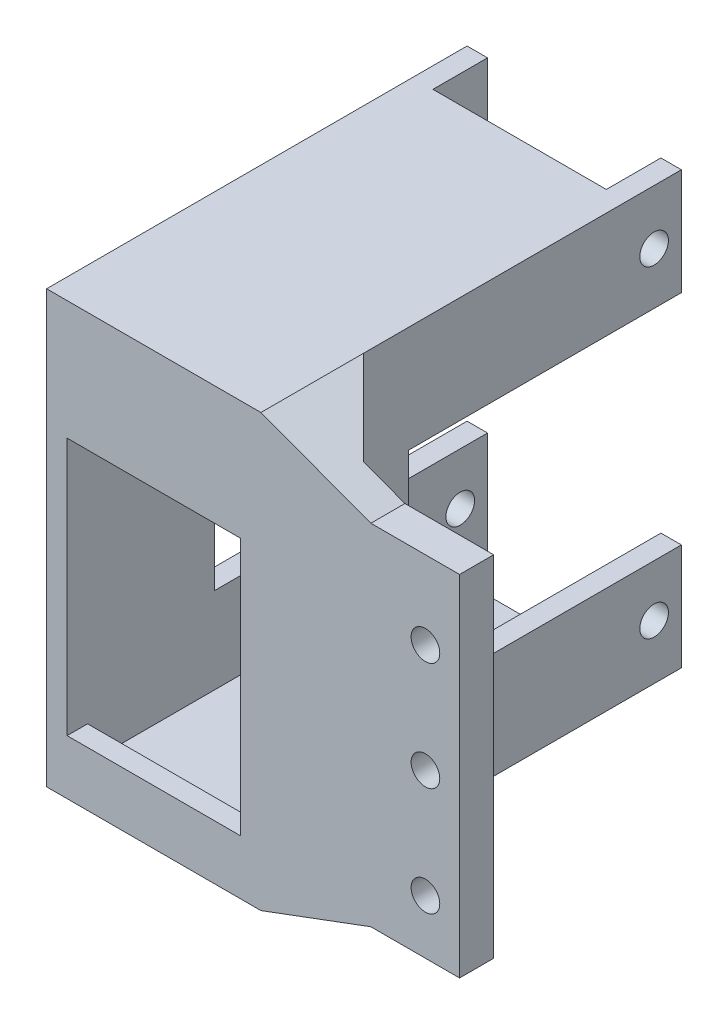
ISO-10303-21;
HEADER;
FILE_DESCRIPTION(('STEP AP214'),'2;1');
FILE_NAME('part.step','',(''),(''),'','','');
FILE_SCHEMA(('AUTOMOTIVE_DESIGN { 1 0 10303 214 1 1 1 1 }'));
ENDSEC;
DATA;
#1=APPLICATION_CONTEXT('core data for automotive mechanical design processes');
#2=APPLICATION_PROTOCOL_DEFINITION('international standard','automotive_design',2000,#1);
#3=PRODUCT_CONTEXT('',#1,'mechanical');
#4=PRODUCT('Part','Part','',(#3));
#5=PRODUCT_RELATED_PRODUCT_CATEGORY('part','',(#4));
#6=PRODUCT_DEFINITION_FORMATION('','',#4);
#7=PRODUCT_DEFINITION_CONTEXT('part definition',#1,'design');
#8=PRODUCT_DEFINITION('design','',#6,#7);
#9=PRODUCT_DEFINITION_SHAPE('','',#8);
#10=(LENGTH_UNIT() NAMED_UNIT(*) SI_UNIT(.MILLI.,.METRE.));
#11=(NAMED_UNIT(*) PLANE_ANGLE_UNIT() SI_UNIT($,.RADIAN.));
#12=(NAMED_UNIT(*) SI_UNIT($,.STERADIAN.) SOLID_ANGLE_UNIT());
#13=UNCERTAINTY_MEASURE_WITH_UNIT(LENGTH_MEASURE(1.E-05),#10,'distance_accuracy_value','');
#14=(GEOMETRIC_REPRESENTATION_CONTEXT(3) GLOBAL_UNCERTAINTY_ASSIGNED_CONTEXT((#13)) GLOBAL_UNIT_ASSIGNED_CONTEXT((#10,
#11,#12)) REPRESENTATION_CONTEXT('',''));
#15=CARTESIAN_POINT('',(0.,0.,0.));
#16=DIRECTION('',(0.,0.,1.));
#17=DIRECTION('',(1.,0.,0.));
#18=AXIS2_PLACEMENT_3D('',#15,#16,#17);
#19=CARTESIAN_POINT('',(0.,0.,-61.6));
#20=DIRECTION('',(0.,0.,1.));
#21=DIRECTION('',(1.,0.,0.));
#22=AXIS2_PLACEMENT_3D('',#19,#20,#21);
#23=PLANE('',#22);
#24=DIRECTION('',(0.,1.,0.));
#25=VECTOR('',#24,1.);
#26=CARTESIAN_POINT('',(-12.7,0.,-61.6));
#27=LINE('',#26,#25);
#28=CARTESIAN_POINT('',(-12.7,-21.9,-61.6));
#29=VERTEX_POINT('',#28);
#30=CARTESIAN_POINT('',(-12.7,-6.3,-61.6));
#31=VERTEX_POINT('',#30);
#32=EDGE_CURVE('E423',#29,#31,#27,.T.);
#33=ORIENTED_EDGE('',*,*,#32,.F.);
#34=DIRECTION('',(1.,0.,0.));
#35=VECTOR('',#34,1.);
#36=CARTESIAN_POINT('',(0.,-21.9,-61.6));
#37=LINE('',#36,#35);
#38=CARTESIAN_POINT('',(-15.7,-21.9,-61.6));
#39=VERTEX_POINT('',#38);
#40=EDGE_CURVE('E428',#39,#29,#37,.T.);
#41=ORIENTED_EDGE('',*,*,#40,.F.);
#42=DIRECTION('',(0.,1.,0.));
#43=VECTOR('',#42,1.);
#44=CARTESIAN_POINT('',(-15.7,0.,-61.6));
#45=LINE('',#44,#43);
#46=CARTESIAN_POINT('',(-15.7,-6.3,-61.6));
#47=VERTEX_POINT('',#46);
#48=EDGE_CURVE('E441',#39,#47,#45,.T.);
#49=ORIENTED_EDGE('',*,*,#48,.T.);
#50=DIRECTION('',(-1.,0.,0.));
#51=VECTOR('',#50,1.);
#52=CARTESIAN_POINT('',(84.3,-6.3,-61.6));
#53=LINE('',#52,#51);
#54=EDGE_CURVE('E363',#31,#47,#53,.T.);
#55=ORIENTED_EDGE('',*,*,#54,.F.);
#56=EDGE_LOOP('',(#33,#41,#49,#55));
#57=FACE_BOUND('',#56,.T.);
#58=ADVANCED_FACE('F47',(#57),#23,.F.);
#59=DIRECTION('',(1.,0.,0.));
#60=VECTOR('',#59,1.);
#61=CARTESIAN_POINT('',(0.,41.3,-61.6));
#62=LINE('',#61,#60);
#63=CARTESIAN_POINT('',(-15.7,41.3,-61.6));
#64=VERTEX_POINT('',#63);
#65=CARTESIAN_POINT('',(-12.7,41.3,-61.6));
#66=VERTEX_POINT('',#65);
#67=EDGE_CURVE('E436',#64,#66,#62,.T.);
#68=ORIENTED_EDGE('',*,*,#67,.T.);
#69=CARTESIAN_POINT('',(-12.7,25.7,-61.6));
#70=VERTEX_POINT('',#69);
#71=EDGE_CURVE('E417',#70,#66,#27,.T.);
#72=ORIENTED_EDGE('',*,*,#71,.F.);
#73=DIRECTION('',(-1.,0.,0.));
#74=VECTOR('',#73,1.);
#75=CARTESIAN_POINT('',(84.3,25.7,-61.6));
#76=LINE('',#75,#74);
#77=CARTESIAN_POINT('',(-15.7,25.7,-61.6));
#78=VERTEX_POINT('',#77);
#79=EDGE_CURVE('E358',#70,#78,#76,.T.);
#80=ORIENTED_EDGE('',*,*,#79,.T.);
#81=EDGE_CURVE('E439',#78,#64,#45,.T.);
#82=ORIENTED_EDGE('',*,*,#81,.T.);
#83=EDGE_LOOP('',(#68,#72,#80,#82));
#84=FACE_BOUND('',#83,.T.);
#85=ADVANCED_FACE('F658',(#84),#23,.F.);
#86=CARTESIAN_POINT('',(0.,-21.9,-3.));
#87=DIRECTION('',(0.,-1.,0.));
#88=DIRECTION('',(0.,0.,-1.));
#89=AXIS2_PLACEMENT_3D('',#86,#87,#88);
#90=PLANE('',#89);
#91=DIRECTION('',(-1.,0.,0.));
#92=VECTOR('',#91,1.);
#93=CARTESIAN_POINT('',(0.,-21.9,-53.6));
#94=LINE('',#93,#92);
#95=CARTESIAN_POINT('',(12.7,-21.9,-53.6));
#96=VERTEX_POINT('',#95);
#97=CARTESIAN_POINT('',(-12.7,-21.9,-53.6));
#98=VERTEX_POINT('',#97);
#99=EDGE_CURVE('E306',#96,#98,#94,.T.);
#100=ORIENTED_EDGE('',*,*,#99,.F.);
#101=DIRECTION('',(0.,0.,-1.));
#102=VECTOR('',#101,1.);
#103=CARTESIAN_POINT('',(12.7,-21.9,-53.6));
#104=LINE('',#103,#102);
#105=CARTESIAN_POINT('',(12.7,-21.9,-61.6));
#106=VERTEX_POINT('',#105);
#107=EDGE_CURVE('E324',#96,#106,#104,.T.);
#108=ORIENTED_EDGE('',*,*,#107,.T.);
#109=CARTESIAN_POINT('',(15.7,-21.9,-61.6));
#110=VERTEX_POINT('',#109);
#111=EDGE_CURVE('E424',#106,#110,#37,.T.);
#112=ORIENTED_EDGE('',*,*,#111,.T.);
#113=DIRECTION('',(0.,0.,1.));
#114=VECTOR('',#113,1.);
#115=CARTESIAN_POINT('',(15.7,-21.9,-61.6));
#116=LINE('',#115,#114);
#117=CARTESIAN_POINT('',(15.7,-21.9,-15.));
#118=VERTEX_POINT('',#117);
#119=EDGE_CURVE('E448',#110,#118,#116,.T.);
#120=ORIENTED_EDGE('',*,*,#119,.T.);
#121=DIRECTION('',(0.,0.,1.));
#122=VECTOR('',#121,1.);
#123=CARTESIAN_POINT('',(15.7,-21.9,-3.));
#124=LINE('',#123,#122);
#125=CARTESIAN_POINT('',(15.7,-21.9,0.));
#126=VERTEX_POINT('',#125);
#127=EDGE_CURVE('E551',#118,#126,#124,.T.);
#128=ORIENTED_EDGE('',*,*,#127,.T.);
#129=DIRECTION('',(1.,0.,0.));
#130=VECTOR('',#129,1.);
#131=CARTESIAN_POINT('',(0.,-21.9,0.));
#132=LINE('',#131,#130);
#133=CARTESIAN_POINT('',(-15.7,-21.9,0.));
#134=VERTEX_POINT('',#133);
#135=EDGE_CURVE('E496',#134,#126,#132,.T.);
#136=ORIENTED_EDGE('',*,*,#135,.F.);
#137=DIRECTION('',(0.,0.,1.));
#138=VECTOR('',#137,1.);
#139=CARTESIAN_POINT('',(-15.7,-21.9,-3.));
#140=LINE('',#139,#138);
#141=EDGE_CURVE('E533',#39,#134,#140,.T.);
#142=ORIENTED_EDGE('',*,*,#141,.F.);
#143=ORIENTED_EDGE('',*,*,#40,.T.);
#144=DIRECTION('',(0.,0.,-1.));
#145=VECTOR('',#144,1.);
#146=CARTESIAN_POINT('',(-12.7,-21.9,-53.6));
#147=LINE('',#146,#145);
#148=EDGE_CURVE('E316',#98,#29,#147,.T.);
#149=ORIENTED_EDGE('',*,*,#148,.F.);
#150=EDGE_LOOP('',(#100,#108,#112,#120,#128,#136,#142,#143,#149));
#151=FACE_BOUND('',#150,.T.);
#152=ADVANCED_FACE('F601',(#151),#90,.T.);
#153=CARTESIAN_POINT('',(0.,38.3,-61.6));
#154=DIRECTION('',(0.,-1.,0.));
#155=DIRECTION('',(0.,0.,-1.));
#156=AXIS2_PLACEMENT_3D('',#153,#154,#155);
#157=PLANE('',#156);
#158=DIRECTION('',(0.,0.,1.));
#159=VECTOR('',#158,1.);
#160=CARTESIAN_POINT('',(-12.7,38.3,-61.6));
#161=LINE('',#160,#159);
#162=CARTESIAN_POINT('',(-12.7,38.3,-53.6));
#163=VERTEX_POINT('',#162);
#164=CARTESIAN_POINT('',(-12.7,38.3,-3.));
#165=VERTEX_POINT('',#164);
#166=EDGE_CURVE('E457',#163,#165,#161,.T.);
#167=ORIENTED_EDGE('',*,*,#166,.F.);
#168=DIRECTION('',(1.,0.,0.));
#169=VECTOR('',#168,1.);
#170=CARTESIAN_POINT('',(0.,38.3,-53.6));
#171=LINE('',#170,#169);
#172=CARTESIAN_POINT('',(12.7,38.3,-53.6));
#173=VERTEX_POINT('',#172);
#174=EDGE_CURVE('E319',#163,#173,#171,.T.);
#175=ORIENTED_EDGE('',*,*,#174,.T.);
#176=DIRECTION('',(0.,0.,1.));
#177=VECTOR('',#176,1.);
#178=CARTESIAN_POINT('',(12.7,38.3,-61.6));
#179=LINE('',#178,#177);
#180=CARTESIAN_POINT('',(12.7,38.3,-3.));
#181=VERTEX_POINT('',#180);
#182=EDGE_CURVE('E451',#173,#181,#179,.T.);
#183=ORIENTED_EDGE('',*,*,#182,.T.);
#184=DIRECTION('',(1.,0.,0.));
#185=VECTOR('',#184,1.);
#186=CARTESIAN_POINT('',(0.,38.3,-3.));
#187=LINE('',#186,#185);
#188=EDGE_CURVE('E466',#165,#181,#187,.T.);
#189=ORIENTED_EDGE('',*,*,#188,.F.);
#190=EDGE_LOOP('',(#167,#175,#183,#189));
#191=FACE_BOUND('',#190,.T.);
#192=ADVANCED_FACE('F710',(#191),#157,.T.);
#193=CARTESIAN_POINT('',(0.,-18.9,-61.6));
#194=DIRECTION('',(0.,-1.,0.));
#195=DIRECTION('',(0.,0.,-1.));
#196=AXIS2_PLACEMENT_3D('',#193,#194,#195);
#197=PLANE('',#196);
#198=DIRECTION('',(1.,0.,0.));
#199=VECTOR('',#198,1.);
#200=CARTESIAN_POINT('',(0.,-18.9,-53.6));
#201=LINE('',#200,#199);
#202=CARTESIAN_POINT('',(-12.7,-18.9,-53.6));
#203=VERTEX_POINT('',#202);
#204=CARTESIAN_POINT('',(12.7,-18.9,-53.6));
#205=VERTEX_POINT('',#204);
#206=EDGE_CURVE('E579',#203,#205,#201,.T.);
#207=ORIENTED_EDGE('',*,*,#206,.F.);
#208=DIRECTION('',(0.,0.,1.));
#209=VECTOR('',#208,1.);
#210=CARTESIAN_POINT('',(-12.7,-18.9,-61.6));
#211=LINE('',#210,#209);
#212=CARTESIAN_POINT('',(-12.7,-18.9,-3.));
#213=VERTEX_POINT('',#212);
#214=EDGE_CURVE('E460',#203,#213,#211,.T.);
#215=ORIENTED_EDGE('',*,*,#214,.T.);
#216=DIRECTION('',(1.,0.,0.));
#217=VECTOR('',#216,1.);
#218=CARTESIAN_POINT('',(0.,-18.9,-3.));
#219=LINE('',#218,#217);
#220=CARTESIAN_POINT('',(12.7,-18.9,-3.00000000000002));
#221=VERTEX_POINT('',#220);
#222=EDGE_CURVE('E446',#213,#221,#219,.T.);
#223=ORIENTED_EDGE('',*,*,#222,.T.);
#224=DIRECTION('',(0.,0.,1.));
#225=VECTOR('',#224,1.);
#226=CARTESIAN_POINT('',(12.7,-18.9,-61.6));
#227=LINE('',#226,#225);
#228=EDGE_CURVE('E444',#205,#221,#227,.T.);
#229=ORIENTED_EDGE('',*,*,#228,.F.);
#230=EDGE_LOOP('',(#207,#215,#223,#229));
#231=FACE_BOUND('',#230,.T.);
#232=ADVANCED_FACE('F667',(#231),#197,.F.);
#233=CARTESIAN_POINT('',(-15.7,0.,-3.));
#234=DIRECTION('',(1.,0.,0.));
#235=DIRECTION('',(0.,0.,-1.));
#236=AXIS2_PLACEMENT_3D('',#233,#234,#235);
#237=PLANE('',#236);
#238=CARTESIAN_POINT('',(-15.7,33.3,-57.6));
#239=DIRECTION('',(-1.,0.,0.));
#240=DIRECTION('',(0.,0.,1.));
#241=AXIS2_PLACEMENT_3D('',#238,#239,#240);
#242=CIRCLE('',#241,2.1);
#243=CARTESIAN_POINT('',(-15.7,33.3,-55.5));
#244=VERTEX_POINT('',#243);
#245=EDGE_CURVE('E339',#244,#244,#242,.T.);
#246=ORIENTED_EDGE('',*,*,#245,.F.);
#247=EDGE_LOOP('',(#246));
#248=FACE_BOUND('',#247,.T.);
#249=CARTESIAN_POINT('',(-15.7,-13.9,-57.6));
#250=DIRECTION('',(-1.,0.,0.));
#251=DIRECTION('',(0.,0.,1.));
#252=AXIS2_PLACEMENT_3D('',#249,#250,#251);
#253=CIRCLE('',#252,2.1);
#254=CARTESIAN_POINT('',(-15.7,-13.9,-55.5));
#255=VERTEX_POINT('',#254);
#256=EDGE_CURVE('E334',#255,#255,#253,.T.);
#257=ORIENTED_EDGE('',*,*,#256,.F.);
#258=EDGE_LOOP('',(#257));
#259=FACE_BOUND('',#258,.T.);
#260=DIRECTION('',(0.,0.,1.));
#261=VECTOR('',#260,1.);
#262=CARTESIAN_POINT('',(-15.7,-6.3,-61.6));
#263=LINE('',#262,#261);
#264=CARTESIAN_POINT('',(-15.7,-6.3,-21.6));
#265=VERTEX_POINT('',#264);
#266=EDGE_CURVE('E344',#47,#265,#263,.T.);
#267=ORIENTED_EDGE('',*,*,#266,.F.);
#268=ORIENTED_EDGE('',*,*,#48,.F.);
#269=ORIENTED_EDGE('',*,*,#141,.T.);
#270=DIRECTION('',(0.,1.,0.));
#271=VECTOR('',#270,1.);
#272=CARTESIAN_POINT('',(-15.7,0.,0.));
#273=LINE('',#272,#271);
#274=CARTESIAN_POINT('',(-15.7,41.3,0.));
#275=VERTEX_POINT('',#274);
#276=EDGE_CURVE('E518',#134,#275,#273,.T.);
#277=ORIENTED_EDGE('',*,*,#276,.T.);
#278=DIRECTION('',(0.,0.,1.));
#279=VECTOR('',#278,1.);
#280=CARTESIAN_POINT('',(-15.7,41.3,-3.));
#281=LINE('',#280,#279);
#282=EDGE_CURVE('E536',#64,#275,#281,.T.);
#283=ORIENTED_EDGE('',*,*,#282,.F.);
#284=ORIENTED_EDGE('',*,*,#81,.F.);
#285=DIRECTION('',(0.,0.,-1.));
#286=VECTOR('',#285,1.);
#287=CARTESIAN_POINT('',(-15.7,25.7,-61.6));
#288=LINE('',#287,#286);
#289=CARTESIAN_POINT('',(-15.7,25.7,-21.6));
#290=VERTEX_POINT('',#289);
#291=EDGE_CURVE('E365',#290,#78,#288,.T.);
#292=ORIENTED_EDGE('',*,*,#291,.F.);
#293=DIRECTION('',(0.,1.,0.));
#294=VECTOR('',#293,1.);
#295=CARTESIAN_POINT('',(-15.7,-6.3,-21.6));
#296=LINE('',#295,#294);
#297=EDGE_CURVE('E362',#265,#290,#296,.T.);
#298=ORIENTED_EDGE('',*,*,#297,.F.);
#299=EDGE_LOOP('',(#267,#268,#269,#277,#283,#284,#292,#298));
#300=FACE_BOUND('',#299,.T.);
#301=ADVANCED_FACE('F653',(#248,#259,#300),#237,.F.);
#302=ORIENTED_EDGE('',*,*,#111,.F.);
#303=DIRECTION('',(0.,1.,0.));
#304=VECTOR('',#303,1.);
#305=CARTESIAN_POINT('',(12.7,0.,-61.6));
#306=LINE('',#305,#304);
#307=CARTESIAN_POINT('',(12.7,-6.3,-61.6));
#308=VERTEX_POINT('',#307);
#309=EDGE_CURVE('E418',#106,#308,#306,.T.);
#310=ORIENTED_EDGE('',*,*,#309,.T.);
#311=CARTESIAN_POINT('',(15.7,-6.3,-61.6));
#312=VERTEX_POINT('',#311);
#313=EDGE_CURVE('E357',#312,#308,#53,.T.);
#314=ORIENTED_EDGE('',*,*,#313,.F.);
#315=DIRECTION('',(0.,1.,0.));
#316=VECTOR('',#315,1.);
#317=CARTESIAN_POINT('',(15.7,0.,-61.6));
#318=LINE('',#317,#316);
#319=EDGE_CURVE('E431',#110,#312,#318,.T.);
#320=ORIENTED_EDGE('',*,*,#319,.F.);
#321=EDGE_LOOP('',(#302,#310,#314,#320));
#322=FACE_BOUND('',#321,.T.);
#323=ADVANCED_FACE('F651',(#322),#23,.F.);
#324=CARTESIAN_POINT('',(0.,0.,-3.));
#325=DIRECTION('',(0.,0.,1.));
#326=DIRECTION('',(1.,0.,0.));
#327=AXIS2_PLACEMENT_3D('',#324,#325,#326);
#328=PLANE('',#327);
#329=DIRECTION('',(0.,1.,0.));
#330=VECTOR('',#329,1.);
#331=CARTESIAN_POINT('',(12.7,0.,-3.));
#332=LINE('',#331,#330);
#333=CARTESIAN_POINT('',(12.7,23.85,-3.));
#334=VERTEX_POINT('',#333);
#335=EDGE_CURVE('E574',#334,#181,#332,.T.);
#336=ORIENTED_EDGE('',*,*,#335,.F.);
#337=DIRECTION('',(1.,0.,0.));
#338=VECTOR('',#337,1.);
#339=CARTESIAN_POINT('',(0.,23.85,-3.));
#340=LINE('',#339,#338);
#341=CARTESIAN_POINT('',(-12.7,23.85,-3.));
#342=VERTEX_POINT('',#341);
#343=EDGE_CURVE('E476',#342,#334,#340,.T.);
#344=ORIENTED_EDGE('',*,*,#343,.F.);
#345=DIRECTION('',(0.,1.,0.));
#346=VECTOR('',#345,1.);
#347=CARTESIAN_POINT('',(-12.7,0.,-3.));
#348=LINE('',#347,#346);
#349=EDGE_CURVE('E571',#342,#165,#348,.T.);
#350=ORIENTED_EDGE('',*,*,#349,.T.);
#351=ORIENTED_EDGE('',*,*,#188,.T.);
#352=EDGE_LOOP('',(#336,#344,#350,#351));
#353=FACE_BOUND('',#352,.T.);
#354=ADVANCED_FACE('F654',(#353),#328,.F.);
#355=CARTESIAN_POINT('',(12.7,-13.9,-3.));
#356=VERTEX_POINT('',#355);
#357=EDGE_CURVE('E569',#221,#356,#332,.T.);
#358=ORIENTED_EDGE('',*,*,#357,.F.);
#359=ORIENTED_EDGE('',*,*,#222,.F.);
#360=CARTESIAN_POINT('',(-12.7,-13.9,-3.));
#361=VERTEX_POINT('',#360);
#362=EDGE_CURVE('E539',#213,#361,#348,.T.);
#363=ORIENTED_EDGE('',*,*,#362,.T.);
#364=DIRECTION('',(1.,0.,0.));
#365=VECTOR('',#364,1.);
#366=CARTESIAN_POINT('',(0.,-13.9,-3.));
#367=LINE('',#366,#365);
#368=EDGE_CURVE('E474',#361,#356,#367,.T.);
#369=ORIENTED_EDGE('',*,*,#368,.T.);
#370=EDGE_LOOP('',(#358,#359,#363,#369));
#371=FACE_BOUND('',#370,.T.);
#372=ADVANCED_FACE('F665',(#371),#328,.F.);
#373=CARTESIAN_POINT('',(0.,41.3,-3.));
#374=DIRECTION('',(0.,-1.,0.));
#375=DIRECTION('',(1.,0.,0.));
#376=AXIS2_PLACEMENT_3D('',#373,#374,#375);
#377=PLANE('',#376);
#378=DIRECTION('',(-1.,0.,0.));
#379=VECTOR('',#378,1.);
#380=CARTESIAN_POINT('',(0.,41.3,-53.6));
#381=LINE('',#380,#379);
#382=CARTESIAN_POINT('',(12.7,41.3,-53.6));
#383=VERTEX_POINT('',#382);
#384=CARTESIAN_POINT('',(-12.7,41.3,-53.6));
#385=VERTEX_POINT('',#384);
#386=EDGE_CURVE('E300',#383,#385,#381,.T.);
#387=ORIENTED_EDGE('',*,*,#386,.T.);
#388=DIRECTION('',(0.,0.,-1.));
#389=VECTOR('',#388,1.);
#390=CARTESIAN_POINT('',(-12.7,41.3,-53.6));
#391=LINE('',#390,#389);
#392=EDGE_CURVE('E313',#385,#66,#391,.T.);
#393=ORIENTED_EDGE('',*,*,#392,.T.);
#394=ORIENTED_EDGE('',*,*,#67,.F.);
#395=ORIENTED_EDGE('',*,*,#282,.T.);
#396=DIRECTION('',(1.,0.,0.));
#397=VECTOR('',#396,1.);
#398=CARTESIAN_POINT('',(0.,41.3,0.));
#399=LINE('',#398,#397);
#400=CARTESIAN_POINT('',(15.7,41.3,0.));
#401=VERTEX_POINT('',#400);
#402=EDGE_CURVE('E520',#275,#401,#399,.T.);
#403=ORIENTED_EDGE('',*,*,#402,.T.);
#404=DIRECTION('',(0.,0.,1.));
#405=VECTOR('',#404,1.);
#406=CARTESIAN_POINT('',(15.7,41.3,-3.));
#407=LINE('',#406,#405);
#408=CARTESIAN_POINT('',(15.7,41.3,-15.));
#409=VERTEX_POINT('',#408);
#410=EDGE_CURVE('E66',#409,#401,#407,.T.);
#411=ORIENTED_EDGE('',*,*,#410,.F.);
#412=DIRECTION('',(0.,0.,1.));
#413=VECTOR('',#412,1.);
#414=CARTESIAN_POINT('',(15.7,41.3,-61.6));
#415=LINE('',#414,#413);
#416=CARTESIAN_POINT('',(15.7,41.3,-61.6));
#417=VERTEX_POINT('',#416);
#418=EDGE_CURVE('E447',#417,#409,#415,.T.);
#419=ORIENTED_EDGE('',*,*,#418,.F.);
#420=CARTESIAN_POINT('',(12.7,41.3,-61.6));
#421=VERTEX_POINT('',#420);
#422=EDGE_CURVE('E434',#421,#417,#62,.T.);
#423=ORIENTED_EDGE('',*,*,#422,.F.);
#424=DIRECTION('',(0.,0.,-1.));
#425=VECTOR('',#424,1.);
#426=CARTESIAN_POINT('',(12.7,41.3,-53.6));
#427=LINE('',#426,#425);
#428=EDGE_CURVE('E312',#383,#421,#427,.T.);
#429=ORIENTED_EDGE('',*,*,#428,.F.);
#430=EDGE_LOOP('',(#387,#393,#394,#395,#403,#411,#419,#423,#429));
#431=FACE_BOUND('',#430,.T.);
#432=ADVANCED_FACE('F635',(#431),#377,.F.);
#433=CARTESIAN_POINT('',(15.4289488838454,41.4010128383185,-3.));
#434=DIRECTION('',(-0.349209233144346,-0.937044775603993,0.));
#435=DIRECTION('',(0.937044775603993,-0.349209233144346,0.));
#436=AXIS2_PLACEMENT_3D('',#433,#434,#435);
#437=PLANE('',#436);
#438=DIRECTION('',(0.937044775603993,-0.349209233144346,0.));
#439=VECTOR('',#438,1.);
#440=CARTESIAN_POINT('',(15.4289488838454,41.4010128383185,0.));
#441=LINE('',#440,#439);
#442=CARTESIAN_POINT('',(31.8,35.3,0.));
#443=VERTEX_POINT('',#442);
#444=EDGE_CURVE('E268',#401,#443,#441,.T.);
#445=ORIENTED_EDGE('',*,*,#444,.T.);
#446=DIRECTION('',(0.,0.,1.));
#447=VECTOR('',#446,1.);
#448=CARTESIAN_POINT('',(31.8,35.3,-3.));
#449=LINE('',#448,#447);
#450=CARTESIAN_POINT('',(31.8,35.3,-5.));
#451=VERTEX_POINT('',#450);
#452=EDGE_CURVE('E263',#451,#443,#449,.T.);
#453=ORIENTED_EDGE('',*,*,#452,.F.);
#454=DIRECTION('',(0.937044775603993,-0.349209233144346,0.));
#455=VECTOR('',#454,1.);
#456=CARTESIAN_POINT('',(15.4289488838454,41.4010128383185,-5.));
#457=LINE('',#456,#455);
#458=CARTESIAN_POINT('',(25.7000000000001,37.5732919254658,-5.));
#459=VERTEX_POINT('',#458);
#460=EDGE_CURVE('E246',#459,#451,#457,.T.);
#461=ORIENTED_EDGE('',*,*,#460,.F.);
#462=DIRECTION('',(-0.683764315212211,0.254818999457967,-0.683764315212205));
#463=VECTOR('',#462,1.);
#464=CARTESIAN_POINT('',(21.1660780635619,39.262952274449,-9.53392193643811));
#465=LINE('',#464,#463);
#466=EDGE_CURVE('E58',#459,#409,#465,.T.);
#467=ORIENTED_EDGE('',*,*,#466,.T.);
#468=ORIENTED_EDGE('',*,*,#410,.T.);
#469=EDGE_LOOP('',(#445,#453,#461,#467,#468));
#470=FACE_BOUND('',#469,.T.);
#471=ADVANCED_FACE('F265',(#470),#437,.F.);
#472=CARTESIAN_POINT('',(0.,35.3,-3.));
#473=DIRECTION('',(0.,-1.,0.));
#474=DIRECTION('',(0.,0.,-1.));
#475=AXIS2_PLACEMENT_3D('',#472,#473,#474);
#476=PLANE('',#475);
#477=DIRECTION('',(1.,0.,0.));
#478=VECTOR('',#477,1.);
#479=CARTESIAN_POINT('',(0.,35.3,0.));
#480=LINE('',#479,#478);
#481=CARTESIAN_POINT('',(44.8,35.3,0.));
#482=VERTEX_POINT('',#481);
#483=EDGE_CURVE('E515',#443,#482,#480,.T.);
#484=ORIENTED_EDGE('',*,*,#483,.T.);
#485=DIRECTION('',(0.,0.,1.));
#486=VECTOR('',#485,1.);
#487=CARTESIAN_POINT('',(44.8,35.3,-3.));
#488=LINE('',#487,#486);
#489=CARTESIAN_POINT('',(44.8,35.3,-5.));
#490=VERTEX_POINT('',#489);
#491=EDGE_CURVE('E267',#490,#482,#488,.T.);
#492=ORIENTED_EDGE('',*,*,#491,.F.);
#493=DIRECTION('',(1.,0.,0.));
#494=VECTOR('',#493,1.);
#495=CARTESIAN_POINT('',(0.,35.3,-5.));
#496=LINE('',#495,#494);
#497=EDGE_CURVE('E254',#451,#490,#496,.T.);
#498=ORIENTED_EDGE('',*,*,#497,.F.);
#499=ORIENTED_EDGE('',*,*,#452,.T.);
#500=EDGE_LOOP('',(#484,#492,#498,#499));
#501=FACE_BOUND('',#500,.T.);
#502=ADVANCED_FACE('F275',(#501),#476,.F.);
#503=CARTESIAN_POINT('',(44.8,0.,-3.));
#504=DIRECTION('',(1.,0.,0.));
#505=DIRECTION('',(0.,0.,-1.));
#506=AXIS2_PLACEMENT_3D('',#503,#504,#505);
#507=PLANE('',#506);
#508=DIRECTION('',(0.,1.,0.));
#509=VECTOR('',#508,1.);
#510=CARTESIAN_POINT('',(44.8,0.,0.));
#511=LINE('',#510,#509);
#512=CARTESIAN_POINT('',(44.8,-15.9,0.));
#513=VERTEX_POINT('',#512);
#514=EDGE_CURVE('E507',#513,#482,#511,.T.);
#515=ORIENTED_EDGE('',*,*,#514,.F.);
#516=DIRECTION('',(0.,0.,1.));
#517=VECTOR('',#516,1.);
#518=CARTESIAN_POINT('',(44.8,-15.9,-3.));
#519=LINE('',#518,#517);
#520=CARTESIAN_POINT('',(44.8,-15.9,-5.));
#521=VERTEX_POINT('',#520);
#522=EDGE_CURVE('E550',#521,#513,#519,.T.);
#523=ORIENTED_EDGE('',*,*,#522,.F.);
#524=DIRECTION('',(0.,1.,0.));
#525=VECTOR('',#524,1.);
#526=CARTESIAN_POINT('',(44.8,0.,-5.));
#527=LINE('',#526,#525);
#528=EDGE_CURVE('E282',#521,#490,#527,.T.);
#529=ORIENTED_EDGE('',*,*,#528,.T.);
#530=ORIENTED_EDGE('',*,*,#491,.T.);
#531=EDGE_LOOP('',(#515,#523,#529,#530));
#532=FACE_BOUND('',#531,.T.);
#533=ADVANCED_FACE('F720',(#532),#507,.T.);
#534=CARTESIAN_POINT('',(0.,-15.9,-3.));
#535=DIRECTION('',(0.,-1.,0.));
#536=DIRECTION('',(0.,0.,-1.));
#537=AXIS2_PLACEMENT_3D('',#534,#535,#536);
#538=PLANE('',#537);
#539=DIRECTION('',(1.,0.,0.));
#540=VECTOR('',#539,1.);
#541=CARTESIAN_POINT('',(0.,-15.9,0.));
#542=LINE('',#541,#540);
#543=CARTESIAN_POINT('',(31.8,-15.9,0.));
#544=VERTEX_POINT('',#543);
#545=EDGE_CURVE('E502',#544,#513,#542,.T.);
#546=ORIENTED_EDGE('',*,*,#545,.F.);
#547=DIRECTION('',(0.,0.,1.));
#548=VECTOR('',#547,1.);
#549=CARTESIAN_POINT('',(31.8,-15.9,-3.));
#550=LINE('',#549,#548);
#551=CARTESIAN_POINT('',(31.8,-15.9,-5.));
#552=VERTEX_POINT('',#551);
#553=EDGE_CURVE('E547',#552,#544,#550,.T.);
#554=ORIENTED_EDGE('',*,*,#553,.F.);
#555=DIRECTION('',(1.,0.,0.));
#556=VECTOR('',#555,1.);
#557=CARTESIAN_POINT('',(0.,-15.9,-5.));
#558=LINE('',#557,#556);
#559=EDGE_CURVE('E279',#552,#521,#558,.T.);
#560=ORIENTED_EDGE('',*,*,#559,.T.);
#561=ORIENTED_EDGE('',*,*,#522,.T.);
#562=EDGE_LOOP('',(#546,#554,#560,#561));
#563=FACE_BOUND('',#562,.T.);
#564=ADVANCED_FACE('F724',(#563),#538,.T.);
#565=CARTESIAN_POINT('',(12.7,0.,-3.));
#566=DIRECTION('',(1.,0.,0.));
#567=DIRECTION('',(0.,0.,-1.));
#568=AXIS2_PLACEMENT_3D('',#565,#566,#567);
#569=PLANE('',#568);
#570=CARTESIAN_POINT('',(12.7,33.3,-57.6));
#571=DIRECTION('',(1.,0.,0.));
#572=DIRECTION('',(0.,0.,-1.));
#573=AXIS2_PLACEMENT_3D('',#570,#571,#572);
#574=CIRCLE('',#573,2.1);
#575=CARTESIAN_POINT('',(12.7,33.3,-59.7));
#576=VERTEX_POINT('',#575);
#577=EDGE_CURVE('E405',#576,#576,#574,.T.);
#578=ORIENTED_EDGE('',*,*,#577,.T.);
#579=EDGE_LOOP('',(#578));
#580=FACE_BOUND('',#579,.T.);
#581=DIRECTION('',(0.,0.,1.));
#582=VECTOR('',#581,1.);
#583=CARTESIAN_POINT('',(12.7,25.7,-3.));
#584=LINE('',#583,#582);
#585=CARTESIAN_POINT('',(12.7,25.7,-61.6));
#586=VERTEX_POINT('',#585);
#587=CARTESIAN_POINT('',(12.7,25.7,-21.6));
#588=VERTEX_POINT('',#587);
#589=EDGE_CURVE('E377',#586,#588,#584,.T.);
#590=ORIENTED_EDGE('',*,*,#589,.T.);
#591=DIRECTION('',(0.,-1.,0.));
#592=VECTOR('',#591,1.);
#593=CARTESIAN_POINT('',(12.7,0.,-21.6));
#594=LINE('',#593,#592);
#595=CARTESIAN_POINT('',(12.7,-6.3,-21.6));
#596=VERTEX_POINT('',#595);
#597=EDGE_CURVE('E394',#588,#596,#594,.T.);
#598=ORIENTED_EDGE('',*,*,#597,.T.);
#599=DIRECTION('',(0.,0.,-1.));
#600=VECTOR('',#599,1.);
#601=CARTESIAN_POINT('',(12.7,-6.3,-3.));
#602=LINE('',#601,#600);
#603=EDGE_CURVE('E390',#596,#308,#602,.T.);
#604=ORIENTED_EDGE('',*,*,#603,.T.);
#605=ORIENTED_EDGE('',*,*,#309,.F.);
#606=ORIENTED_EDGE('',*,*,#107,.F.);
#607=DIRECTION('',(0.,1.,0.));
#608=VECTOR('',#607,1.);
#609=CARTESIAN_POINT('',(12.7,0.,-53.6));
#610=LINE('',#609,#608);
#611=EDGE_CURVE('E305',#96,#205,#610,.T.);
#612=ORIENTED_EDGE('',*,*,#611,.T.);
#613=ORIENTED_EDGE('',*,*,#228,.T.);
#614=ORIENTED_EDGE('',*,*,#357,.T.);
#615=DIRECTION('',(0.,0.,1.));
#616=VECTOR('',#615,1.);
#617=CARTESIAN_POINT('',(12.7,-13.9,-3.));
#618=LINE('',#617,#616);
#619=CARTESIAN_POINT('',(12.7,-13.9,0.));
#620=VERTEX_POINT('',#619);
#621=EDGE_CURVE('E483',#356,#620,#618,.T.);
#622=ORIENTED_EDGE('',*,*,#621,.T.);
#623=DIRECTION('',(0.,1.,0.));
#624=VECTOR('',#623,1.);
#625=CARTESIAN_POINT('',(12.7,0.,0.));
#626=LINE('',#625,#624);
#627=CARTESIAN_POINT('',(12.7,23.85,0.));
#628=VERTEX_POINT('',#627);
#629=EDGE_CURVE('E475',#620,#628,#626,.T.);
#630=ORIENTED_EDGE('',*,*,#629,.T.);
#631=DIRECTION('',(0.,0.,1.));
#632=VECTOR('',#631,1.);
#633=CARTESIAN_POINT('',(12.7,23.85,-3.));
#634=LINE('',#633,#632);
#635=EDGE_CURVE('E558',#334,#628,#634,.T.);
#636=ORIENTED_EDGE('',*,*,#635,.F.);
#637=ORIENTED_EDGE('',*,*,#335,.T.);
#638=ORIENTED_EDGE('',*,*,#182,.F.);
#639=EDGE_CURVE('E301',#173,#383,#610,.T.);
#640=ORIENTED_EDGE('',*,*,#639,.T.);
#641=ORIENTED_EDGE('',*,*,#428,.T.);
#642=EDGE_CURVE('E415',#586,#421,#306,.T.);
#643=ORIENTED_EDGE('',*,*,#642,.F.);
#644=EDGE_LOOP('',(#590,#598,#604,#605,#606,#612,#613,#614,#622,#630,#636,#637,#638,#640,#641,#643));
#645=FACE_BOUND('',#644,.T.);
#646=CARTESIAN_POINT('',(12.7,-13.9,-57.6));
#647=DIRECTION('',(1.,0.,0.));
#648=DIRECTION('',(0.,0.,-1.));
#649=AXIS2_PLACEMENT_3D('',#646,#647,#648);
#650=CIRCLE('',#649,2.1);
#651=CARTESIAN_POINT('',(12.7,-13.9,-59.7));
#652=VERTEX_POINT('',#651);
#653=EDGE_CURVE('E411',#652,#652,#650,.T.);
#654=ORIENTED_EDGE('',*,*,#653,.T.);
#655=EDGE_LOOP('',(#654));
#656=FACE_BOUND('',#655,.T.);
#657=ADVANCED_FACE('F625',(#580,#645,#656),#569,.F.);
#658=CARTESIAN_POINT('',(0.,23.85,-3.));
#659=DIRECTION('',(0.,-1.,0.));
#660=DIRECTION('',(0.,0.,-1.));
#661=AXIS2_PLACEMENT_3D('',#658,#659,#660);
#662=PLANE('',#661);
#663=DIRECTION('',(1.,0.,0.));
#664=VECTOR('',#663,1.);
#665=CARTESIAN_POINT('',(0.,23.85,0.));
#666=LINE('',#665,#664);
#667=CARTESIAN_POINT('',(-12.7,23.85,0.));
#668=VERTEX_POINT('',#667);
#669=EDGE_CURVE('E495',#668,#628,#666,.T.);
#670=ORIENTED_EDGE('',*,*,#669,.F.);
#671=DIRECTION('',(0.,0.,1.));
#672=VECTOR('',#671,1.);
#673=CARTESIAN_POINT('',(-12.7,23.85,-3.));
#674=LINE('',#673,#672);
#675=EDGE_CURVE('E559',#342,#668,#674,.T.);
#676=ORIENTED_EDGE('',*,*,#675,.F.);
#677=ORIENTED_EDGE('',*,*,#343,.T.);
#678=ORIENTED_EDGE('',*,*,#635,.T.);
#679=EDGE_LOOP('',(#670,#676,#677,#678));
#680=FACE_BOUND('',#679,.T.);
#681=ADVANCED_FACE('F746',(#680),#662,.T.);
#682=CARTESIAN_POINT('',(-12.7,0.,-3.));
#683=DIRECTION('',(1.,0.,0.));
#684=DIRECTION('',(0.,0.,-1.));
#685=AXIS2_PLACEMENT_3D('',#682,#683,#684);
#686=PLANE('',#685);
#687=ORIENTED_EDGE('',*,*,#71,.T.);
#688=ORIENTED_EDGE('',*,*,#392,.F.);
#689=DIRECTION('',(0.,1.,0.));
#690=VECTOR('',#689,1.);
#691=CARTESIAN_POINT('',(-12.7,0.,-53.6));
#692=LINE('',#691,#690);
#693=EDGE_CURVE('E307',#163,#385,#692,.T.);
#694=ORIENTED_EDGE('',*,*,#693,.F.);
#695=ORIENTED_EDGE('',*,*,#166,.T.);
#696=ORIENTED_EDGE('',*,*,#349,.F.);
#697=ORIENTED_EDGE('',*,*,#675,.T.);
#698=DIRECTION('',(0.,1.,0.));
#699=VECTOR('',#698,1.);
#700=CARTESIAN_POINT('',(-12.7,0.,0.));
#701=LINE('',#700,#699);
#702=CARTESIAN_POINT('',(-12.7,-13.9,0.));
#703=VERTEX_POINT('',#702);
#704=EDGE_CURVE('E486',#703,#668,#701,.T.);
#705=ORIENTED_EDGE('',*,*,#704,.F.);
#706=DIRECTION('',(0.,0.,1.));
#707=VECTOR('',#706,1.);
#708=CARTESIAN_POINT('',(-12.7,-13.9,-3.));
#709=LINE('',#708,#707);
#710=EDGE_CURVE('E565',#361,#703,#709,.T.);
#711=ORIENTED_EDGE('',*,*,#710,.F.);
#712=ORIENTED_EDGE('',*,*,#362,.F.);
#713=ORIENTED_EDGE('',*,*,#214,.F.);
#714=EDGE_CURVE('E309',#98,#203,#692,.T.);
#715=ORIENTED_EDGE('',*,*,#714,.F.);
#716=ORIENTED_EDGE('',*,*,#148,.T.);
#717=ORIENTED_EDGE('',*,*,#32,.T.);
#718=DIRECTION('',(0.,0.,-1.));
#719=VECTOR('',#718,1.);
#720=CARTESIAN_POINT('',(-12.7,-6.3,-3.));
#721=LINE('',#720,#719);
#722=CARTESIAN_POINT('',(-12.7,-6.3,-21.6));
#723=VERTEX_POINT('',#722);
#724=EDGE_CURVE('E381',#723,#31,#721,.T.);
#725=ORIENTED_EDGE('',*,*,#724,.F.);
#726=DIRECTION('',(0.,-1.,0.));
#727=VECTOR('',#726,1.);
#728=CARTESIAN_POINT('',(-12.7,0.,-21.6));
#729=LINE('',#728,#727);
#730=CARTESIAN_POINT('',(-12.7,25.7,-21.6));
#731=VERTEX_POINT('',#730);
#732=EDGE_CURVE('E388',#731,#723,#729,.T.);
#733=ORIENTED_EDGE('',*,*,#732,.F.);
#734=DIRECTION('',(0.,0.,1.));
#735=VECTOR('',#734,1.);
#736=CARTESIAN_POINT('',(-12.7,25.7,-3.));
#737=LINE('',#736,#735);
#738=EDGE_CURVE('E374',#70,#731,#737,.T.);
#739=ORIENTED_EDGE('',*,*,#738,.F.);
#740=EDGE_LOOP('',(#687,#688,#694,#695,#696,#697,#705,#711,#712,#713,#715,#716,#717,#725,#733,#739));
#741=FACE_BOUND('',#740,.T.);
#742=CARTESIAN_POINT('',(-12.7,33.3,-57.6));
#743=DIRECTION('',(1.,0.,0.));
#744=DIRECTION('',(0.,0.,-1.));
#745=AXIS2_PLACEMENT_3D('',#742,#743,#744);
#746=CIRCLE('',#745,2.1);
#747=CARTESIAN_POINT('',(-12.7,33.3,-59.7));
#748=VERTEX_POINT('',#747);
#749=EDGE_CURVE('E396',#748,#748,#746,.T.);
#750=ORIENTED_EDGE('',*,*,#749,.F.);
#751=EDGE_LOOP('',(#750));
#752=FACE_BOUND('',#751,.T.);
#753=CARTESIAN_POINT('',(-12.7,-13.9,-57.6));
#754=DIRECTION('',(1.,0.,0.));
#755=DIRECTION('',(0.,0.,-1.));
#756=AXIS2_PLACEMENT_3D('',#753,#754,#755);
#757=CIRCLE('',#756,2.1);
#758=CARTESIAN_POINT('',(-12.7,-13.9,-59.7));
#759=VERTEX_POINT('',#758);
#760=EDGE_CURVE('E410',#759,#759,#757,.T.);
#761=ORIENTED_EDGE('',*,*,#760,.F.);
#762=EDGE_LOOP('',(#761));
#763=FACE_BOUND('',#762,.T.);
#764=ADVANCED_FACE('F684',(#741,#752,#763),#686,.T.);
#765=CARTESIAN_POINT('',(39.8,7.95000000000001,-3.));
#766=DIRECTION('',(0.,0.,1.));
#767=DIRECTION('',(1.,0.,0.));
#768=AXIS2_PLACEMENT_3D('',#765,#766,#767);
#769=CYLINDRICAL_SURFACE('',#768,2.1);
#770=CARTESIAN_POINT('',(39.8,7.95000000000001,0.));
#771=DIRECTION('',(0.,0.,1.));
#772=DIRECTION('',(1.,0.,0.));
#773=AXIS2_PLACEMENT_3D('',#770,#771,#772);
#774=CIRCLE('',#773,2.1);
#775=CARTESIAN_POINT('',(41.9,7.95000000000001,0.));
#776=VERTEX_POINT('',#775);
#777=EDGE_CURVE('E526',#776,#776,#774,.T.);
#778=ORIENTED_EDGE('',*,*,#777,.T.);
#779=EDGE_LOOP('',(#778));
#780=FACE_BOUND('',#779,.T.);
#781=CARTESIAN_POINT('',(39.8,7.95000000000001,-5.));
#782=DIRECTION('',(0.,0.,1.));
#783=DIRECTION('',(1.,0.,0.));
#784=AXIS2_PLACEMENT_3D('',#781,#782,#783);
#785=CIRCLE('',#784,2.1);
#786=CARTESIAN_POINT('',(41.9,7.95000000000001,-5.));
#787=VERTEX_POINT('',#786);
#788=EDGE_CURVE('E289',#787,#787,#785,.T.);
#789=ORIENTED_EDGE('',*,*,#788,.F.);
#790=EDGE_LOOP('',(#789));
#791=FACE_BOUND('',#790,.T.);
#792=ADVANCED_FACE('F740',(#780,#791),#769,.F.);
#793=CARTESIAN_POINT('',(39.8,23.85,-3.));
#794=DIRECTION('',(0.,0.,1.));
#795=DIRECTION('',(1.,0.,0.));
#796=AXIS2_PLACEMENT_3D('',#793,#794,#795);
#797=CYLINDRICAL_SURFACE('',#796,2.1);
#798=CARTESIAN_POINT('',(39.8,23.85,0.));
#799=DIRECTION('',(0.,0.,1.));
#800=DIRECTION('',(1.,0.,0.));
#801=AXIS2_PLACEMENT_3D('',#798,#799,#800);
#802=CIRCLE('',#801,2.1);
#803=CARTESIAN_POINT('',(41.9,23.85,0.));
#804=VERTEX_POINT('',#803);
#805=EDGE_CURVE('E523',#804,#804,#802,.T.);
#806=ORIENTED_EDGE('',*,*,#805,.T.);
#807=EDGE_LOOP('',(#806));
#808=FACE_BOUND('',#807,.T.);
#809=CARTESIAN_POINT('',(39.8,23.85,-5.));
#810=DIRECTION('',(0.,0.,1.));
#811=DIRECTION('',(1.,0.,0.));
#812=AXIS2_PLACEMENT_3D('',#809,#810,#811);
#813=CIRCLE('',#812,2.1);
#814=CARTESIAN_POINT('',(41.9,23.85,-5.));
#815=VERTEX_POINT('',#814);
#816=EDGE_CURVE('E285',#815,#815,#813,.T.);
#817=ORIENTED_EDGE('',*,*,#816,.F.);
#818=EDGE_LOOP('',(#817));
#819=FACE_BOUND('',#818,.T.);
#820=ADVANCED_FACE('F729',(#808,#819),#797,.F.);
#821=CARTESIAN_POINT('',(9.08078994614005,-24.3667863554758,-3.));
#822=DIRECTION('',(0.349209233144346,-0.937044775603993,0.));
#823=DIRECTION('',(0.937044775603993,0.349209233144346,0.));
#824=AXIS2_PLACEMENT_3D('',#821,#822,#823);
#825=PLANE('',#824);
#826=DIRECTION('',(0.937044775603993,0.349209233144346,0.));
#827=VECTOR('',#826,1.);
#828=CARTESIAN_POINT('',(9.08078994614005,-24.3667863554758,0.));
#829=LINE('',#828,#827);
#830=EDGE_CURVE('E499',#126,#544,#829,.T.);
#831=ORIENTED_EDGE('',*,*,#830,.F.);
#832=ORIENTED_EDGE('',*,*,#127,.F.);
#833=DIRECTION('',(0.683764315212211,0.254818999457967,0.683764315212205));
#834=VECTOR('',#833,1.);
#835=CARTESIAN_POINT('',(28.8664442119694,-16.993250604235,-1.83355578803074));
#836=LINE('',#835,#834);
#837=CARTESIAN_POINT('',(25.7000000000001,-18.1732919254658,-5.));
#838=VERTEX_POINT('',#837);
#839=EDGE_CURVE('E11',#118,#838,#836,.T.);
#840=ORIENTED_EDGE('',*,*,#839,.T.);
#841=DIRECTION('',(0.937044775603993,0.349209233144346,0.));
#842=VECTOR('',#841,1.);
#843=CARTESIAN_POINT('',(9.08078994614005,-24.3667863554758,-5.));
#844=LINE('',#843,#842);
#845=EDGE_CURVE('E258',#838,#552,#844,.T.);
#846=ORIENTED_EDGE('',*,*,#845,.T.);
#847=ORIENTED_EDGE('',*,*,#553,.T.);
#848=EDGE_LOOP('',(#831,#832,#840,#846,#847));
#849=FACE_BOUND('',#848,.T.);
#850=ADVANCED_FACE('F727',(#849),#825,.T.);
#851=CARTESIAN_POINT('',(0.,-13.9,-3.));
#852=DIRECTION('',(0.,-1.,0.));
#853=DIRECTION('',(1.,0.,0.));
#854=AXIS2_PLACEMENT_3D('',#851,#852,#853);
#855=PLANE('',#854);
#856=DIRECTION('',(1.,0.,0.));
#857=VECTOR('',#856,1.);
#858=CARTESIAN_POINT('',(0.,-13.9,0.));
#859=LINE('',#858,#857);
#860=EDGE_CURVE('E482',#703,#620,#859,.T.);
#861=ORIENTED_EDGE('',*,*,#860,.T.);
#862=ORIENTED_EDGE('',*,*,#621,.F.);
#863=ORIENTED_EDGE('',*,*,#368,.F.);
#864=ORIENTED_EDGE('',*,*,#710,.T.);
#865=EDGE_LOOP('',(#861,#862,#863,#864));
#866=FACE_BOUND('',#865,.T.);
#867=ADVANCED_FACE('F726',(#866),#855,.F.);
#868=CARTESIAN_POINT('',(39.8,-7.94999999999999,-3.));
#869=DIRECTION('',(0.,0.,1.));
#870=DIRECTION('',(1.,0.,0.));
#871=AXIS2_PLACEMENT_3D('',#868,#869,#870);
#872=CYLINDRICAL_SURFACE('',#871,2.1);
#873=CARTESIAN_POINT('',(39.8,-7.94999999999999,0.));
#874=DIRECTION('',(0.,0.,1.));
#875=DIRECTION('',(1.,0.,0.));
#876=AXIS2_PLACEMENT_3D('',#873,#874,#875);
#877=CIRCLE('',#876,2.1);
#878=CARTESIAN_POINT('',(41.9,-7.94999999999999,0.));
#879=VERTEX_POINT('',#878);
#880=EDGE_CURVE('E477',#879,#879,#877,.T.);
#881=ORIENTED_EDGE('',*,*,#880,.T.);
#882=EDGE_LOOP('',(#881));
#883=FACE_BOUND('',#882,.T.);
#884=CARTESIAN_POINT('',(39.8,-7.94999999999999,-5.));
#885=DIRECTION('',(0.,0.,1.));
#886=DIRECTION('',(1.,0.,0.));
#887=AXIS2_PLACEMENT_3D('',#884,#885,#886);
#888=CIRCLE('',#887,2.1);
#889=CARTESIAN_POINT('',(41.9,-7.94999999999999,-5.));
#890=VERTEX_POINT('',#889);
#891=EDGE_CURVE('E291',#890,#890,#888,.T.);
#892=ORIENTED_EDGE('',*,*,#891,.F.);
#893=EDGE_LOOP('',(#892));
#894=FACE_BOUND('',#893,.T.);
#895=ADVANCED_FACE('F736',(#883,#894),#872,.F.);
#896=CARTESIAN_POINT('',(0.,0.,0.));
#897=DIRECTION('',(0.,0.,1.));
#898=DIRECTION('',(1.,0.,0.));
#899=AXIS2_PLACEMENT_3D('',#896,#897,#898);
#900=PLANE('',#899);
#901=ORIENTED_EDGE('',*,*,#444,.F.);
#902=ORIENTED_EDGE('',*,*,#402,.F.);
#903=ORIENTED_EDGE('',*,*,#276,.F.);
#904=ORIENTED_EDGE('',*,*,#135,.T.);
#905=ORIENTED_EDGE('',*,*,#830,.T.);
#906=ORIENTED_EDGE('',*,*,#545,.T.);
#907=ORIENTED_EDGE('',*,*,#514,.T.);
#908=ORIENTED_EDGE('',*,*,#483,.F.);
#909=EDGE_LOOP('',(#901,#902,#903,#904,#905,#906,#907,#908));
#910=FACE_BOUND('',#909,.T.);
#911=ORIENTED_EDGE('',*,*,#805,.F.);
#912=EDGE_LOOP('',(#911));
#913=FACE_BOUND('',#912,.T.);
#914=ORIENTED_EDGE('',*,*,#777,.F.);
#915=EDGE_LOOP('',(#914));
#916=FACE_BOUND('',#915,.T.);
#917=ORIENTED_EDGE('',*,*,#880,.F.);
#918=EDGE_LOOP('',(#917));
#919=FACE_BOUND('',#918,.T.);
#920=ORIENTED_EDGE('',*,*,#629,.F.);
#921=ORIENTED_EDGE('',*,*,#860,.F.);
#922=ORIENTED_EDGE('',*,*,#704,.T.);
#923=ORIENTED_EDGE('',*,*,#669,.T.);
#924=EDGE_LOOP('',(#920,#921,#922,#923));
#925=FACE_BOUND('',#924,.T.);
#926=ADVANCED_FACE('F713',(#910,#913,#916,#919,#925),#900,.T.);
#927=CARTESIAN_POINT('',(15.7,0.,-61.6));
#928=DIRECTION('',(1.,0.,0.));
#929=DIRECTION('',(0.,0.,-1.));
#930=AXIS2_PLACEMENT_3D('',#927,#928,#929);
#931=PLANE('',#930);
#932=ORIENTED_EDGE('',*,*,#418,.T.);
#933=DIRECTION('',(0.,-1.,0.));
#934=VECTOR('',#933,1.);
#935=CARTESIAN_POINT('',(15.7,0.,-15.));
#936=LINE('',#935,#934);
#937=EDGE_CURVE('E588',#409,#118,#936,.T.);
#938=ORIENTED_EDGE('',*,*,#937,.T.);
#939=ORIENTED_EDGE('',*,*,#119,.F.);
#940=ORIENTED_EDGE('',*,*,#319,.T.);
#941=DIRECTION('',(0.,0.,-1.));
#942=VECTOR('',#941,1.);
#943=CARTESIAN_POINT('',(15.7,-6.3,-61.6));
#944=LINE('',#943,#942);
#945=CARTESIAN_POINT('',(15.7,-6.3,-21.6));
#946=VERTEX_POINT('',#945);
#947=EDGE_CURVE('E382',#946,#312,#944,.T.);
#948=ORIENTED_EDGE('',*,*,#947,.F.);
#949=DIRECTION('',(0.,-1.,0.));
#950=VECTOR('',#949,1.);
#951=CARTESIAN_POINT('',(15.7,0.,-21.6));
#952=LINE('',#951,#950);
#953=CARTESIAN_POINT('',(15.7,25.7,-21.6));
#954=VERTEX_POINT('',#953);
#955=EDGE_CURVE('E352',#954,#946,#952,.T.);
#956=ORIENTED_EDGE('',*,*,#955,.F.);
#957=DIRECTION('',(0.,0.,1.));
#958=VECTOR('',#957,1.);
#959=CARTESIAN_POINT('',(15.7,25.7,-61.6));
#960=LINE('',#959,#958);
#961=CARTESIAN_POINT('',(15.7,25.7,-61.6));
#962=VERTEX_POINT('',#961);
#963=EDGE_CURVE('E336',#962,#954,#960,.T.);
#964=ORIENTED_EDGE('',*,*,#963,.F.);
#965=EDGE_CURVE('E427',#962,#417,#318,.T.);
#966=ORIENTED_EDGE('',*,*,#965,.T.);
#967=EDGE_LOOP('',(#932,#938,#939,#940,#948,#956,#964,#966));
#968=FACE_BOUND('',#967,.T.);
#969=CARTESIAN_POINT('',(15.7,-13.9,-57.6));
#970=DIRECTION('',(1.,0.,0.));
#971=DIRECTION('',(0.,0.,-1.));
#972=AXIS2_PLACEMENT_3D('',#969,#970,#971);
#973=CIRCLE('',#972,2.1);
#974=CARTESIAN_POINT('',(15.7,-13.9,-59.7));
#975=VERTEX_POINT('',#974);
#976=EDGE_CURVE('E407',#975,#975,#973,.T.);
#977=ORIENTED_EDGE('',*,*,#976,.F.);
#978=EDGE_LOOP('',(#977));
#979=FACE_BOUND('',#978,.T.);
#980=CARTESIAN_POINT('',(15.7,33.3,-57.6));
#981=DIRECTION('',(1.,0.,0.));
#982=DIRECTION('',(0.,0.,-1.));
#983=AXIS2_PLACEMENT_3D('',#980,#981,#982);
#984=CIRCLE('',#983,2.1);
#985=CARTESIAN_POINT('',(15.7,33.3,-59.7));
#986=VERTEX_POINT('',#985);
#987=EDGE_CURVE('E400',#986,#986,#984,.T.);
#988=ORIENTED_EDGE('',*,*,#987,.F.);
#989=EDGE_LOOP('',(#988));
#990=FACE_BOUND('',#989,.T.);
#991=ADVANCED_FACE('F596',(#968,#979,#990),#931,.T.);
#992=ORIENTED_EDGE('',*,*,#642,.T.);
#993=ORIENTED_EDGE('',*,*,#422,.T.);
#994=ORIENTED_EDGE('',*,*,#965,.F.);
#995=EDGE_CURVE('E353',#962,#586,#76,.T.);
#996=ORIENTED_EDGE('',*,*,#995,.T.);
#997=EDGE_LOOP('',(#992,#993,#994,#996));
#998=FACE_BOUND('',#997,.T.);
#999=ADVANCED_FACE('F638',(#998),#23,.F.);
#1000=CARTESIAN_POINT('',(84.3,-6.3,-21.6));
#1001=DIRECTION('',(0.,0.,1.));
#1002=DIRECTION('',(1.,0.,0.));
#1003=AXIS2_PLACEMENT_3D('',#1000,#1001,#1002);
#1004=PLANE('',#1003);
#1005=DIRECTION('',(-1.,0.,0.));
#1006=VECTOR('',#1005,1.);
#1007=CARTESIAN_POINT('',(84.3,25.7,-21.6));
#1008=LINE('',#1007,#1006);
#1009=EDGE_CURVE('E349',#954,#588,#1008,.T.);
#1010=ORIENTED_EDGE('',*,*,#1009,.F.);
#1011=ORIENTED_EDGE('',*,*,#955,.T.);
#1012=DIRECTION('',(-1.,0.,0.));
#1013=VECTOR('',#1012,1.);
#1014=CARTESIAN_POINT('',(84.3,-6.3,-21.6));
#1015=LINE('',#1014,#1013);
#1016=EDGE_CURVE('E347',#946,#596,#1015,.T.);
#1017=ORIENTED_EDGE('',*,*,#1016,.T.);
#1018=ORIENTED_EDGE('',*,*,#597,.F.);
#1019=EDGE_LOOP('',(#1010,#1011,#1017,#1018));
#1020=FACE_BOUND('',#1019,.T.);
#1021=ADVANCED_FACE('F644',(#1020),#1004,.F.);
#1022=CARTESIAN_POINT('',(84.3,25.7,-61.6));
#1023=DIRECTION('',(0.,1.,0.));
#1024=DIRECTION('',(0.,0.,1.));
#1025=AXIS2_PLACEMENT_3D('',#1022,#1023,#1024);
#1026=PLANE('',#1025);
#1027=ORIENTED_EDGE('',*,*,#995,.F.);
#1028=ORIENTED_EDGE('',*,*,#963,.T.);
#1029=ORIENTED_EDGE('',*,*,#1009,.T.);
#1030=ORIENTED_EDGE('',*,*,#589,.F.);
#1031=EDGE_LOOP('',(#1027,#1028,#1029,#1030));
#1032=FACE_BOUND('',#1031,.T.);
#1033=ADVANCED_FACE('F643',(#1032),#1026,.F.);
#1034=CARTESIAN_POINT('',(84.3,-6.3,-61.6));
#1035=DIRECTION('',(0.,-1.,0.));
#1036=DIRECTION('',(0.,0.,-1.));
#1037=AXIS2_PLACEMENT_3D('',#1034,#1035,#1036);
#1038=PLANE('',#1037);
#1039=ORIENTED_EDGE('',*,*,#1016,.F.);
#1040=ORIENTED_EDGE('',*,*,#947,.T.);
#1041=ORIENTED_EDGE('',*,*,#313,.T.);
#1042=ORIENTED_EDGE('',*,*,#603,.F.);
#1043=EDGE_LOOP('',(#1039,#1040,#1041,#1042));
#1044=FACE_BOUND('',#1043,.T.);
#1045=ADVANCED_FACE('F649',(#1044),#1038,.F.);
#1046=CARTESIAN_POINT('',(84.3,33.3,-57.6));
#1047=DIRECTION('',(-1.,0.,0.));
#1048=DIRECTION('',(0.,0.,1.));
#1049=AXIS2_PLACEMENT_3D('',#1046,#1047,#1048);
#1050=CYLINDRICAL_SURFACE('',#1049,2.1);
#1051=ORIENTED_EDGE('',*,*,#987,.T.);
#1052=EDGE_LOOP('',(#1051));
#1053=FACE_BOUND('',#1052,.T.);
#1054=ORIENTED_EDGE('',*,*,#577,.F.);
#1055=EDGE_LOOP('',(#1054));
#1056=FACE_BOUND('',#1055,.T.);
#1057=ADVANCED_FACE('F757',(#1053,#1056),#1050,.F.);
#1058=CARTESIAN_POINT('',(84.3,-13.9,-57.6));
#1059=DIRECTION('',(-1.,0.,0.));
#1060=DIRECTION('',(0.,0.,1.));
#1061=AXIS2_PLACEMENT_3D('',#1058,#1059,#1060);
#1062=CYLINDRICAL_SURFACE('',#1061,2.1);
#1063=ORIENTED_EDGE('',*,*,#976,.T.);
#1064=EDGE_LOOP('',(#1063));
#1065=FACE_BOUND('',#1064,.T.);
#1066=ORIENTED_EDGE('',*,*,#653,.F.);
#1067=EDGE_LOOP('',(#1066));
#1068=FACE_BOUND('',#1067,.T.);
#1069=ADVANCED_FACE('F761',(#1065,#1068),#1062,.F.);
#1070=ORIENTED_EDGE('',*,*,#724,.T.);
#1071=ORIENTED_EDGE('',*,*,#54,.T.);
#1072=ORIENTED_EDGE('',*,*,#266,.T.);
#1073=EDGE_CURVE('E341',#723,#265,#1015,.T.);
#1074=ORIENTED_EDGE('',*,*,#1073,.F.);
#1075=EDGE_LOOP('',(#1070,#1071,#1072,#1074));
#1076=FACE_BOUND('',#1075,.T.);
#1077=ADVANCED_FACE('F696',(#1076),#1038,.F.);
#1078=ORIENTED_EDGE('',*,*,#738,.T.);
#1079=EDGE_CURVE('E331',#731,#290,#1008,.T.);
#1080=ORIENTED_EDGE('',*,*,#1079,.T.);
#1081=ORIENTED_EDGE('',*,*,#291,.T.);
#1082=ORIENTED_EDGE('',*,*,#79,.F.);
#1083=EDGE_LOOP('',(#1078,#1080,#1081,#1082));
#1084=FACE_BOUND('',#1083,.T.);
#1085=ADVANCED_FACE('F782',(#1084),#1026,.F.);
#1086=ORIENTED_EDGE('',*,*,#732,.T.);
#1087=ORIENTED_EDGE('',*,*,#1073,.T.);
#1088=ORIENTED_EDGE('',*,*,#297,.T.);
#1089=ORIENTED_EDGE('',*,*,#1079,.F.);
#1090=EDGE_LOOP('',(#1086,#1087,#1088,#1089));
#1091=FACE_BOUND('',#1090,.T.);
#1092=ADVANCED_FACE('F773',(#1091),#1004,.F.);
#1093=ORIENTED_EDGE('',*,*,#749,.T.);
#1094=EDGE_LOOP('',(#1093));
#1095=FACE_BOUND('',#1094,.T.);
#1096=ORIENTED_EDGE('',*,*,#245,.T.);
#1097=EDGE_LOOP('',(#1096));
#1098=FACE_BOUND('',#1097,.T.);
#1099=ADVANCED_FACE('F762',(#1095,#1098),#1050,.F.);
#1100=ORIENTED_EDGE('',*,*,#760,.T.);
#1101=EDGE_LOOP('',(#1100));
#1102=FACE_BOUND('',#1101,.T.);
#1103=ORIENTED_EDGE('',*,*,#256,.T.);
#1104=EDGE_LOOP('',(#1103));
#1105=FACE_BOUND('',#1104,.T.);
#1106=ADVANCED_FACE('F772',(#1102,#1105),#1062,.F.);
#1107=CARTESIAN_POINT('',(0.,0.,-53.6));
#1108=DIRECTION('',(0.,0.,-1.));
#1109=DIRECTION('',(-1.,0.,0.));
#1110=AXIS2_PLACEMENT_3D('',#1107,#1108,#1109);
#1111=PLANE('',#1110);
#1112=ORIENTED_EDGE('',*,*,#206,.T.);
#1113=ORIENTED_EDGE('',*,*,#611,.F.);
#1114=ORIENTED_EDGE('',*,*,#99,.T.);
#1115=ORIENTED_EDGE('',*,*,#714,.T.);
#1116=EDGE_LOOP('',(#1112,#1113,#1114,#1115));
#1117=FACE_BOUND('',#1116,.T.);
#1118=ADVANCED_FACE('F778',(#1117),#1111,.T.);
#1119=ORIENTED_EDGE('',*,*,#693,.T.);
#1120=ORIENTED_EDGE('',*,*,#386,.F.);
#1121=ORIENTED_EDGE('',*,*,#639,.F.);
#1122=ORIENTED_EDGE('',*,*,#174,.F.);
#1123=EDGE_LOOP('',(#1119,#1120,#1121,#1122));
#1124=FACE_BOUND('',#1123,.T.);
#1125=ADVANCED_FACE('F627',(#1124),#1111,.T.);
#1126=CARTESIAN_POINT('',(0.,0.,-5.));
#1127=DIRECTION('',(0.,0.,1.));
#1128=DIRECTION('',(1.,0.,0.));
#1129=AXIS2_PLACEMENT_3D('',#1126,#1127,#1128);
#1130=PLANE('',#1129);
#1131=ORIENTED_EDGE('',*,*,#845,.F.);
#1132=DIRECTION('',(0.,1.,0.));
#1133=VECTOR('',#1132,1.);
#1134=CARTESIAN_POINT('',(25.7000000000001,0.,-5.));
#1135=LINE('',#1134,#1133);
#1136=EDGE_CURVE('E257',#838,#459,#1135,.T.);
#1137=ORIENTED_EDGE('',*,*,#1136,.T.);
#1138=ORIENTED_EDGE('',*,*,#460,.T.);
#1139=ORIENTED_EDGE('',*,*,#497,.T.);
#1140=ORIENTED_EDGE('',*,*,#528,.F.);
#1141=ORIENTED_EDGE('',*,*,#559,.F.);
#1142=EDGE_LOOP('',(#1131,#1137,#1138,#1139,#1140,#1141));
#1143=FACE_BOUND('',#1142,.T.);
#1144=ORIENTED_EDGE('',*,*,#816,.T.);
#1145=EDGE_LOOP('',(#1144));
#1146=FACE_BOUND('',#1145,.T.);
#1147=ORIENTED_EDGE('',*,*,#788,.T.);
#1148=EDGE_LOOP('',(#1147));
#1149=FACE_BOUND('',#1148,.T.);
#1150=ORIENTED_EDGE('',*,*,#891,.T.);
#1151=EDGE_LOOP('',(#1150));
#1152=FACE_BOUND('',#1151,.T.);
#1153=ADVANCED_FACE('F248',(#1143,#1146,#1149,#1152),#1130,.F.);
#1154=CARTESIAN_POINT('',(25.7000000000001,0.,-5.));
#1155=DIRECTION('',(-0.707106781186544,0.,0.707106781186551));
#1156=DIRECTION('',(0.,1.,0.));
#1157=AXIS2_PLACEMENT_3D('',#1154,#1155,#1156);
#1158=PLANE('',#1157);
#1159=ORIENTED_EDGE('',*,*,#839,.F.);
#1160=ORIENTED_EDGE('',*,*,#937,.F.);
#1161=ORIENTED_EDGE('',*,*,#466,.F.);
#1162=ORIENTED_EDGE('',*,*,#1136,.F.);
#1163=EDGE_LOOP('',(#1159,#1160,#1161,#1162));
#1164=FACE_BOUND('',#1163,.T.);
#1165=ADVANCED_FACE('F55',(#1164),#1158,.F.);
#1166=CLOSED_SHELL('',(#58,#85,#152,#192,#232,#301,#323,#354,#372,#432,#471,#502,#533,#564,#657,
#681,#764,#792,#820,#850,#867,#895,#926,#991,#999,#1021,#1033,#1045,#1057,#1069,#1077,#1085,
#1092,#1099,#1106,#1118,#1125,#1153,#1165));
#1167=MANIFOLD_SOLID_BREP('B2',#1166);
#1168=ADVANCED_BREP_SHAPE_REPRESENTATION('',(#18,#1167),#14);
#1169=SHAPE_DEFINITION_REPRESENTATION(#9,#1168);
ENDSEC;
END-ISO-10303-21;
